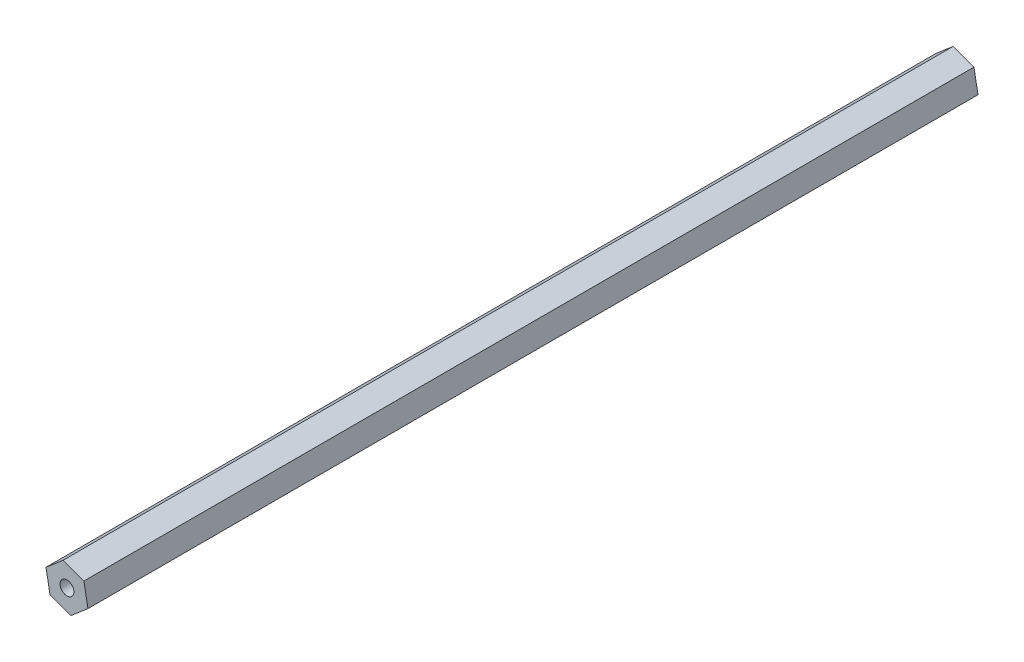
ISO-10303-21;
HEADER;
FILE_DESCRIPTION(('STEP AP214'),'2;1');
FILE_NAME('part.step','',(''),(''),'','','');
FILE_SCHEMA(('AUTOMOTIVE_DESIGN { 1 0 10303 214 1 1 1 1 }'));
ENDSEC;
DATA;
#1=APPLICATION_CONTEXT('core data for automotive mechanical design processes');
#2=APPLICATION_PROTOCOL_DEFINITION('international standard','automotive_design',2000,#1);
#3=PRODUCT_CONTEXT('',#1,'mechanical');
#4=PRODUCT('Part','Part','',(#3));
#5=PRODUCT_RELATED_PRODUCT_CATEGORY('part','',(#4));
#6=PRODUCT_DEFINITION_FORMATION('','',#4);
#7=PRODUCT_DEFINITION_CONTEXT('part definition',#1,'design');
#8=PRODUCT_DEFINITION('design','',#6,#7);
#9=PRODUCT_DEFINITION_SHAPE('','',#8);
#10=(LENGTH_UNIT() NAMED_UNIT(*) SI_UNIT(.MILLI.,.METRE.));
#11=(NAMED_UNIT(*) PLANE_ANGLE_UNIT() SI_UNIT($,.RADIAN.));
#12=(NAMED_UNIT(*) SI_UNIT($,.STERADIAN.) SOLID_ANGLE_UNIT());
#13=UNCERTAINTY_MEASURE_WITH_UNIT(LENGTH_MEASURE(1.E-05),#10,'distance_accuracy_value','');
#14=(GEOMETRIC_REPRESENTATION_CONTEXT(3) GLOBAL_UNCERTAINTY_ASSIGNED_CONTEXT((#13)) GLOBAL_UNIT_ASSIGNED_CONTEXT((#10,
#11,#12)) REPRESENTATION_CONTEXT('',''));
#15=CARTESIAN_POINT('',(0.,0.,0.));
#16=DIRECTION('',(0.,0.,1.));
#17=DIRECTION('',(1.,0.,0.));
#18=AXIS2_PLACEMENT_3D('',#15,#16,#17);
#19=CARTESIAN_POINT('',(0.729309367425421,-3.93295154388985,160.));
#20=DIRECTION('',(-0.649519052838325,0.760345316287281,0.));
#21=DIRECTION('',(-0.760345316287281,-0.649519052838325,0.));
#22=AXIS2_PLACEMENT_3D('',#19,#20,#21);
#23=PLANE('',#22);
#24=DIRECTION('',(0.760345316287281,0.649519052838325,0.));
#25=VECTOR('',#24,1.);
#26=CARTESIAN_POINT('',(0.729309367425421,-3.93295154388985,0.));
#27=LINE('',#26,#25);
#28=CARTESIAN_POINT('',(0.729309367425421,-3.93295154388985,0.));
#29=VERTEX_POINT('',#28);
#30=CARTESIAN_POINT('',(3.77069063257454,-1.33487533253655,0.));
#31=VERTEX_POINT('',#30);
#32=EDGE_CURVE('E123',#29,#31,#27,.T.);
#33=ORIENTED_EDGE('',*,*,#32,.T.);
#34=DIRECTION('',(0.,0.,-1.));
#35=VECTOR('',#34,1.);
#36=CARTESIAN_POINT('',(3.77069063257454,-1.33487533253655,160.));
#37=LINE('',#36,#35);
#38=CARTESIAN_POINT('',(3.77069063257454,-1.33487533253655,160.));
#39=VERTEX_POINT('',#38);
#40=EDGE_CURVE('E11',#39,#31,#37,.T.);
#41=ORIENTED_EDGE('',*,*,#40,.F.);
#42=DIRECTION('',(0.760345316287281,0.649519052838325,0.));
#43=VECTOR('',#42,1.);
#44=CARTESIAN_POINT('',(0.729309367425421,-3.93295154388985,160.));
#45=LINE('',#44,#43);
#46=CARTESIAN_POINT('',(0.729309367425421,-3.93295154388985,160.));
#47=VERTEX_POINT('',#46);
#48=EDGE_CURVE('E134',#47,#39,#45,.T.);
#49=ORIENTED_EDGE('',*,*,#48,.F.);
#50=DIRECTION('',(0.,0.,-1.));
#51=VECTOR('',#50,1.);
#52=CARTESIAN_POINT('',(0.729309367425421,-3.93295154388985,160.));
#53=LINE('',#52,#51);
#54=EDGE_CURVE('E119',#47,#29,#53,.T.);
#55=ORIENTED_EDGE('',*,*,#54,.T.);
#56=EDGE_LOOP('',(#33,#41,#49,#55));
#57=FACE_BOUND('',#56,.T.);
#58=ADVANCED_FACE('F39',(#57),#23,.F.);
#59=CARTESIAN_POINT('',(3.77069063257454,-1.33487533253655,160.));
#60=DIRECTION('',(-0.983237885972462,-0.182327341856355,0.));
#61=DIRECTION('',(0.182327341856355,-0.983237885972462,0.));
#62=AXIS2_PLACEMENT_3D('',#59,#60,#61);
#63=PLANE('',#62);
#64=DIRECTION('',(-0.182327341856355,0.983237885972462,0.));
#65=VECTOR('',#64,1.);
#66=CARTESIAN_POINT('',(3.77069063257454,-1.33487533253655,0.));
#67=LINE('',#66,#65);
#68=CARTESIAN_POINT('',(3.04138126514912,2.5980762113533,0.));
#69=VERTEX_POINT('',#68);
#70=EDGE_CURVE('E126',#31,#69,#67,.T.);
#71=ORIENTED_EDGE('',*,*,#70,.T.);
#72=DIRECTION('',(0.,0.,-1.));
#73=VECTOR('',#72,1.);
#74=CARTESIAN_POINT('',(3.04138126514912,2.5980762113533,160.));
#75=LINE('',#74,#73);
#76=CARTESIAN_POINT('',(3.04138126514912,2.5980762113533,160.));
#77=VERTEX_POINT('',#76);
#78=EDGE_CURVE('E47',#77,#69,#75,.T.);
#79=ORIENTED_EDGE('',*,*,#78,.F.);
#80=DIRECTION('',(-0.182327341856355,0.983237885972462,0.));
#81=VECTOR('',#80,1.);
#82=CARTESIAN_POINT('',(3.77069063257454,-1.33487533253655,160.));
#83=LINE('',#82,#81);
#84=EDGE_CURVE('E92',#39,#77,#83,.T.);
#85=ORIENTED_EDGE('',*,*,#84,.F.);
#86=ORIENTED_EDGE('',*,*,#40,.T.);
#87=EDGE_LOOP('',(#71,#79,#85,#86));
#88=FACE_BOUND('',#87,.T.);
#89=ADVANCED_FACE('F160',(#88),#63,.F.);
#90=CARTESIAN_POINT('',(3.04138126514912,2.5980762113533,160.));
#91=DIRECTION('',(-0.333718833134137,-0.942672658143637,0.));
#92=DIRECTION('',(0.942672658143637,-0.333718833134137,0.));
#93=AXIS2_PLACEMENT_3D('',#90,#91,#92);
#94=PLANE('',#93);
#95=DIRECTION('',(-0.942672658143637,0.333718833134137,0.));
#96=VECTOR('',#95,1.);
#97=CARTESIAN_POINT('',(3.04138126514912,2.5980762113533,0.));
#98=LINE('',#97,#96);
#99=CARTESIAN_POINT('',(-0.729309367425422,3.93295154388985,0.));
#100=VERTEX_POINT('',#99);
#101=EDGE_CURVE('E129',#69,#100,#98,.T.);
#102=ORIENTED_EDGE('',*,*,#101,.T.);
#103=DIRECTION('',(0.,0.,-1.));
#104=VECTOR('',#103,1.);
#105=CARTESIAN_POINT('',(-0.729309367425422,3.93295154388985,160.));
#106=LINE('',#105,#104);
#107=CARTESIAN_POINT('',(-0.729309367425422,3.93295154388985,160.));
#108=VERTEX_POINT('',#107);
#109=EDGE_CURVE('E114',#108,#100,#106,.T.);
#110=ORIENTED_EDGE('',*,*,#109,.F.);
#111=DIRECTION('',(-0.942672658143637,0.333718833134137,0.));
#112=VECTOR('',#111,1.);
#113=CARTESIAN_POINT('',(3.04138126514912,2.5980762113533,160.));
#114=LINE('',#113,#112);
#115=EDGE_CURVE('E105',#77,#108,#114,.T.);
#116=ORIENTED_EDGE('',*,*,#115,.F.);
#117=ORIENTED_EDGE('',*,*,#78,.T.);
#118=EDGE_LOOP('',(#102,#110,#116,#117));
#119=FACE_BOUND('',#118,.T.);
#120=ADVANCED_FACE('F140',(#119),#94,.F.);
#121=CARTESIAN_POINT('',(-0.729309367425422,3.93295154388985,160.));
#122=DIRECTION('',(0.649519052838325,-0.760345316287281,0.));
#123=DIRECTION('',(0.760345316287281,0.649519052838325,0.));
#124=AXIS2_PLACEMENT_3D('',#121,#122,#123);
#125=PLANE('',#124);
#126=DIRECTION('',(-0.760345316287281,-0.649519052838325,0.));
#127=VECTOR('',#126,1.);
#128=CARTESIAN_POINT('',(-0.729309367425422,3.93295154388985,0.));
#129=LINE('',#128,#127);
#130=CARTESIAN_POINT('',(-3.77069063257455,1.33487533253655,0.));
#131=VERTEX_POINT('',#130);
#132=EDGE_CURVE('E113',#100,#131,#129,.T.);
#133=ORIENTED_EDGE('',*,*,#132,.T.);
#134=DIRECTION('',(0.,0.,-1.));
#135=VECTOR('',#134,1.);
#136=CARTESIAN_POINT('',(-3.77069063257455,1.33487533253655,160.));
#137=LINE('',#136,#135);
#138=CARTESIAN_POINT('',(-3.77069063257455,1.33487533253655,160.));
#139=VERTEX_POINT('',#138);
#140=EDGE_CURVE('E110',#139,#131,#137,.T.);
#141=ORIENTED_EDGE('',*,*,#140,.F.);
#142=DIRECTION('',(-0.760345316287281,-0.649519052838325,0.));
#143=VECTOR('',#142,1.);
#144=CARTESIAN_POINT('',(-0.729309367425422,3.93295154388985,160.));
#145=LINE('',#144,#143);
#146=EDGE_CURVE('E99',#108,#139,#145,.T.);
#147=ORIENTED_EDGE('',*,*,#146,.F.);
#148=ORIENTED_EDGE('',*,*,#109,.T.);
#149=EDGE_LOOP('',(#133,#141,#147,#148));
#150=FACE_BOUND('',#149,.T.);
#151=ADVANCED_FACE('F111',(#150),#125,.F.);
#152=CARTESIAN_POINT('',(-3.77069063257455,1.33487533253655,160.));
#153=DIRECTION('',(0.983237885972462,0.182327341856355,0.));
#154=DIRECTION('',(-0.182327341856355,0.983237885972462,0.));
#155=AXIS2_PLACEMENT_3D('',#152,#153,#154);
#156=PLANE('',#155);
#157=DIRECTION('',(0.182327341856355,-0.983237885972462,0.));
#158=VECTOR('',#157,1.);
#159=CARTESIAN_POINT('',(-3.77069063257455,1.33487533253655,0.));
#160=LINE('',#159,#158);
#161=CARTESIAN_POINT('',(-3.04138126514913,-2.5980762113533,0.));
#162=VERTEX_POINT('',#161);
#163=EDGE_CURVE('E78',#131,#162,#160,.T.);
#164=ORIENTED_EDGE('',*,*,#163,.T.);
#165=DIRECTION('',(0.,0.,-1.));
#166=VECTOR('',#165,1.);
#167=CARTESIAN_POINT('',(-3.04138126514913,-2.5980762113533,160.));
#168=LINE('',#167,#166);
#169=CARTESIAN_POINT('',(-3.04138126514913,-2.5980762113533,160.));
#170=VERTEX_POINT('',#169);
#171=EDGE_CURVE('E115',#170,#162,#168,.T.);
#172=ORIENTED_EDGE('',*,*,#171,.F.);
#173=DIRECTION('',(0.182327341856355,-0.983237885972462,0.));
#174=VECTOR('',#173,1.);
#175=CARTESIAN_POINT('',(-3.77069063257455,1.33487533253655,160.));
#176=LINE('',#175,#174);
#177=EDGE_CURVE('E103',#139,#170,#176,.T.);
#178=ORIENTED_EDGE('',*,*,#177,.F.);
#179=ORIENTED_EDGE('',*,*,#140,.T.);
#180=EDGE_LOOP('',(#164,#172,#178,#179));
#181=FACE_BOUND('',#180,.T.);
#182=ADVANCED_FACE('F117',(#181),#156,.F.);
#183=CARTESIAN_POINT('',(-3.04138126514913,-2.5980762113533,160.));
#184=DIRECTION('',(0.333718833134137,0.942672658143637,0.));
#185=DIRECTION('',(-0.942672658143637,0.333718833134137,0.));
#186=AXIS2_PLACEMENT_3D('',#183,#184,#185);
#187=PLANE('',#186);
#188=DIRECTION('',(0.942672658143637,-0.333718833134137,0.));
#189=VECTOR('',#188,1.);
#190=CARTESIAN_POINT('',(-3.04138126514913,-2.5980762113533,0.));
#191=LINE('',#190,#189);
#192=EDGE_CURVE('E84',#162,#29,#191,.T.);
#193=ORIENTED_EDGE('',*,*,#192,.T.);
#194=ORIENTED_EDGE('',*,*,#54,.F.);
#195=DIRECTION('',(0.942672658143637,-0.333718833134137,0.));
#196=VECTOR('',#195,1.);
#197=CARTESIAN_POINT('',(-3.04138126514913,-2.5980762113533,160.));
#198=LINE('',#197,#196);
#199=EDGE_CURVE('E55',#170,#47,#198,.T.);
#200=ORIENTED_EDGE('',*,*,#199,.F.);
#201=ORIENTED_EDGE('',*,*,#171,.T.);
#202=EDGE_LOOP('',(#193,#194,#200,#201));
#203=FACE_BOUND('',#202,.T.);
#204=ADVANCED_FACE('F147',(#203),#187,.F.);
#205=CARTESIAN_POINT('',(0.,0.,160.));
#206=DIRECTION('',(0.,0.,1.));
#207=DIRECTION('',(1.,0.,0.));
#208=AXIS2_PLACEMENT_3D('',#205,#206,#207);
#209=PLANE('',#208);
#210=CARTESIAN_POINT('',(0.,0.,160.));
#211=DIRECTION('',(0.,0.,-1.));
#212=DIRECTION('',(-1.,0.,0.));
#213=AXIS2_PLACEMENT_3D('',#210,#211,#212);
#214=CIRCLE('',#213,1.25);
#215=CARTESIAN_POINT('',(-1.25,0.,160.));
#216=VERTEX_POINT('',#215);
#217=EDGE_CURVE('E239',#216,#216,#214,.T.);
#218=ORIENTED_EDGE('',*,*,#217,.T.);
#219=EDGE_LOOP('',(#218));
#220=FACE_BOUND('',#219,.T.);
#221=ORIENTED_EDGE('',*,*,#48,.T.);
#222=ORIENTED_EDGE('',*,*,#84,.T.);
#223=ORIENTED_EDGE('',*,*,#115,.T.);
#224=ORIENTED_EDGE('',*,*,#146,.T.);
#225=ORIENTED_EDGE('',*,*,#177,.T.);
#226=ORIENTED_EDGE('',*,*,#199,.T.);
#227=EDGE_LOOP('',(#221,#222,#223,#224,#225,#226));
#228=FACE_BOUND('',#227,.T.);
#229=ADVANCED_FACE('F101',(#220,#228),#209,.T.);
#230=CARTESIAN_POINT('',(0.,0.,0.));
#231=DIRECTION('',(0.,0.,1.));
#232=DIRECTION('',(1.,0.,0.));
#233=AXIS2_PLACEMENT_3D('',#230,#231,#232);
#234=PLANE('',#233);
#235=CARTESIAN_POINT('',(0.,0.,0.));
#236=DIRECTION('',(0.,0.,-1.));
#237=DIRECTION('',(-1.,0.,0.));
#238=AXIS2_PLACEMENT_3D('',#235,#236,#237);
#239=CIRCLE('',#238,1.25);
#240=CARTESIAN_POINT('',(-1.25,0.,0.));
#241=VERTEX_POINT('',#240);
#242=EDGE_CURVE('E238',#241,#241,#239,.T.);
#243=ORIENTED_EDGE('',*,*,#242,.F.);
#244=EDGE_LOOP('',(#243));
#245=FACE_BOUND('',#244,.T.);
#246=ORIENTED_EDGE('',*,*,#32,.F.);
#247=ORIENTED_EDGE('',*,*,#192,.F.);
#248=ORIENTED_EDGE('',*,*,#163,.F.);
#249=ORIENTED_EDGE('',*,*,#132,.F.);
#250=ORIENTED_EDGE('',*,*,#101,.F.);
#251=ORIENTED_EDGE('',*,*,#70,.F.);
#252=EDGE_LOOP('',(#246,#247,#248,#249,#250,#251));
#253=FACE_BOUND('',#252,.T.);
#254=ADVANCED_FACE('F143',(#245,#253),#234,.F.);
#255=CARTESIAN_POINT('',(0.,0.,5.));
#256=DIRECTION('',(0.,0.,-1.));
#257=DIRECTION('',(-1.,0.,0.));
#258=AXIS2_PLACEMENT_3D('',#255,#256,#257);
#259=CYLINDRICAL_SURFACE('',#258,1.25);
#260=CARTESIAN_POINT('',(0.,0.,5.));
#261=DIRECTION('',(0.,0.,-1.));
#262=DIRECTION('',(-1.,0.,0.));
#263=AXIS2_PLACEMENT_3D('',#260,#261,#262);
#264=CIRCLE('',#263,1.25);
#265=CARTESIAN_POINT('',(-1.25,0.,5.));
#266=VERTEX_POINT('',#265);
#267=EDGE_CURVE('E127',#266,#266,#264,.T.);
#268=ORIENTED_EDGE('',*,*,#267,.F.);
#269=EDGE_LOOP('',(#268));
#270=FACE_BOUND('',#269,.T.);
#271=ORIENTED_EDGE('',*,*,#242,.T.);
#272=EDGE_LOOP('',(#271));
#273=FACE_BOUND('',#272,.T.);
#274=ADVANCED_FACE('F191',(#270,#273),#259,.F.);
#275=CARTESIAN_POINT('',(0.,0.,5.));
#276=DIRECTION('',(0.,0.,-1.));
#277=DIRECTION('',(-1.,0.,0.));
#278=AXIS2_PLACEMENT_3D('',#275,#276,#277);
#279=PLANE('',#278);
#280=ORIENTED_EDGE('',*,*,#267,.T.);
#281=EDGE_LOOP('',(#280));
#282=FACE_BOUND('',#281,.T.);
#283=ADVANCED_FACE('F199',(#282),#279,.T.);
#284=CARTESIAN_POINT('',(0.,0.,155.));
#285=DIRECTION('',(0.,0.,1.));
#286=DIRECTION('',(1.,0.,0.));
#287=AXIS2_PLACEMENT_3D('',#284,#285,#286);
#288=CYLINDRICAL_SURFACE('',#287,1.25);
#289=CARTESIAN_POINT('',(0.,0.,155.));
#290=DIRECTION('',(0.,0.,-1.));
#291=DIRECTION('',(-1.,0.,0.));
#292=AXIS2_PLACEMENT_3D('',#289,#290,#291);
#293=CIRCLE('',#292,1.25);
#294=CARTESIAN_POINT('',(-1.25,0.,155.));
#295=VERTEX_POINT('',#294);
#296=EDGE_CURVE('E237',#295,#295,#293,.T.);
#297=ORIENTED_EDGE('',*,*,#296,.T.);
#298=EDGE_LOOP('',(#297));
#299=FACE_BOUND('',#298,.T.);
#300=ORIENTED_EDGE('',*,*,#217,.F.);
#301=EDGE_LOOP('',(#300));
#302=FACE_BOUND('',#301,.T.);
#303=ADVANCED_FACE('F208',(#299,#302),#288,.F.);
#304=CARTESIAN_POINT('',(0.,0.,155.));
#305=DIRECTION('',(0.,0.,1.));
#306=DIRECTION('',(-1.,0.,0.));
#307=AXIS2_PLACEMENT_3D('',#304,#305,#306);
#308=PLANE('',#307);
#309=ORIENTED_EDGE('',*,*,#296,.F.);
#310=EDGE_LOOP('',(#309));
#311=FACE_BOUND('',#310,.T.);
#312=ADVANCED_FACE('F221',(#311),#308,.T.);
#313=CLOSED_SHELL('',(#58,#89,#120,#151,#182,#204,#229,#254,#274,#283,#303,#312));
#314=MANIFOLD_SOLID_BREP('B2',#313);
#315=ADVANCED_BREP_SHAPE_REPRESENTATION('',(#18,#314),#14);
#316=SHAPE_DEFINITION_REPRESENTATION(#9,#315);
ENDSEC;
END-ISO-10303-21;
